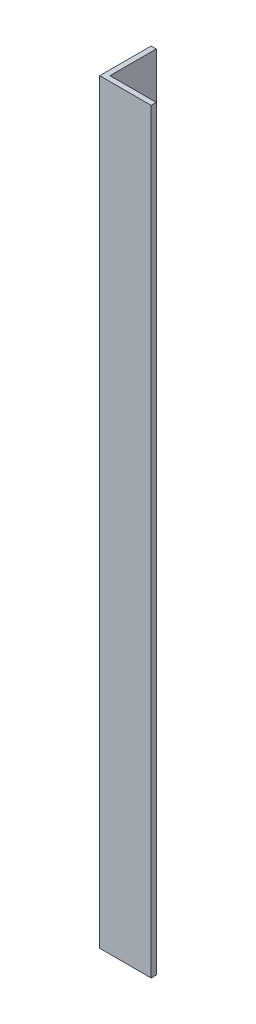
ISO-10303-21;
HEADER;
FILE_DESCRIPTION(('STEP AP214'),'2;1');
FILE_NAME('part.step','',(''),(''),'','','');
FILE_SCHEMA(('AUTOMOTIVE_DESIGN { 1 0 10303 214 1 1 1 1 }'));
ENDSEC;
DATA;
#1=APPLICATION_CONTEXT('core data for automotive mechanical design processes');
#2=APPLICATION_PROTOCOL_DEFINITION('international standard','automotive_design',2000,#1);
#3=PRODUCT_CONTEXT('',#1,'mechanical');
#4=PRODUCT('Part','Part','',(#3));
#5=PRODUCT_RELATED_PRODUCT_CATEGORY('part','',(#4));
#6=PRODUCT_DEFINITION_FORMATION('','',#4);
#7=PRODUCT_DEFINITION_CONTEXT('part definition',#1,'design');
#8=PRODUCT_DEFINITION('design','',#6,#7);
#9=PRODUCT_DEFINITION_SHAPE('','',#8);
#10=(LENGTH_UNIT() NAMED_UNIT(*) SI_UNIT(.MILLI.,.METRE.));
#11=(NAMED_UNIT(*) PLANE_ANGLE_UNIT() SI_UNIT($,.RADIAN.));
#12=(NAMED_UNIT(*) SI_UNIT($,.STERADIAN.) SOLID_ANGLE_UNIT());
#13=UNCERTAINTY_MEASURE_WITH_UNIT(LENGTH_MEASURE(1.E-05),#10,'distance_accuracy_value','');
#14=(GEOMETRIC_REPRESENTATION_CONTEXT(3) GLOBAL_UNCERTAINTY_ASSIGNED_CONTEXT((#13)) GLOBAL_UNIT_ASSIGNED_CONTEXT((#10,
#11,#12)) REPRESENTATION_CONTEXT('',''));
#15=CARTESIAN_POINT('',(0.,0.,0.));
#16=DIRECTION('',(0.,0.,1.));
#17=DIRECTION('',(1.,0.,0.));
#18=AXIS2_PLACEMENT_3D('',#15,#16,#17);
#19=CARTESIAN_POINT('',(0.,294.,0.));
#20=DIRECTION('',(1.,0.,0.));
#21=DIRECTION('',(0.,0.,-1.));
#22=AXIS2_PLACEMENT_3D('',#19,#20,#21);
#23=PLANE('',#22);
#24=DIRECTION('',(0.,0.,1.));
#25=VECTOR('',#24,1.);
#26=CARTESIAN_POINT('',(0.,0.,0.));
#27=LINE('',#26,#25);
#28=CARTESIAN_POINT('',(0.,0.,-20.));
#29=VERTEX_POINT('',#28);
#30=CARTESIAN_POINT('',(0.,0.,0.));
#31=VERTEX_POINT('',#30);
#32=EDGE_CURVE('E128',#29,#31,#27,.T.);
#33=ORIENTED_EDGE('',*,*,#32,.T.);
#34=DIRECTION('',(0.,-1.,0.));
#35=VECTOR('',#34,1.);
#36=CARTESIAN_POINT('',(0.,294.,0.));
#37=LINE('',#36,#35);
#38=CARTESIAN_POINT('',(0.,294.,0.));
#39=VERTEX_POINT('',#38);
#40=EDGE_CURVE('E11',#39,#31,#37,.T.);
#41=ORIENTED_EDGE('',*,*,#40,.F.);
#42=DIRECTION('',(0.,0.,1.));
#43=VECTOR('',#42,1.);
#44=CARTESIAN_POINT('',(0.,294.,0.));
#45=LINE('',#44,#43);
#46=CARTESIAN_POINT('',(0.,294.,-20.));
#47=VERTEX_POINT('',#46);
#48=EDGE_CURVE('E144',#47,#39,#45,.T.);
#49=ORIENTED_EDGE('',*,*,#48,.F.);
#50=DIRECTION('',(0.,-1.,0.));
#51=VECTOR('',#50,1.);
#52=CARTESIAN_POINT('',(0.,294.,-20.));
#53=LINE('',#52,#51);
#54=EDGE_CURVE('E124',#47,#29,#53,.T.);
#55=ORIENTED_EDGE('',*,*,#54,.T.);
#56=EDGE_LOOP('',(#33,#41,#49,#55));
#57=FACE_BOUND('',#56,.T.);
#58=ADVANCED_FACE('F39',(#57),#23,.F.);
#59=CARTESIAN_POINT('',(0.,294.,0.));
#60=DIRECTION('',(0.,0.,-1.));
#61=DIRECTION('',(-1.,0.,0.));
#62=AXIS2_PLACEMENT_3D('',#59,#60,#61);
#63=PLANE('',#62);
#64=DIRECTION('',(1.,0.,0.));
#65=VECTOR('',#64,1.);
#66=CARTESIAN_POINT('',(0.,0.,0.));
#67=LINE('',#66,#65);
#68=CARTESIAN_POINT('',(20.,0.,0.));
#69=VERTEX_POINT('',#68);
#70=EDGE_CURVE('E132',#31,#69,#67,.T.);
#71=ORIENTED_EDGE('',*,*,#70,.T.);
#72=DIRECTION('',(0.,-1.,0.));
#73=VECTOR('',#72,1.);
#74=CARTESIAN_POINT('',(20.,294.,0.));
#75=LINE('',#74,#73);
#76=CARTESIAN_POINT('',(20.,294.,0.));
#77=VERTEX_POINT('',#76);
#78=EDGE_CURVE('E48',#77,#69,#75,.T.);
#79=ORIENTED_EDGE('',*,*,#78,.F.);
#80=DIRECTION('',(1.,0.,0.));
#81=VECTOR('',#80,1.);
#82=CARTESIAN_POINT('',(0.,294.,0.));
#83=LINE('',#82,#81);
#84=EDGE_CURVE('E93',#39,#77,#83,.T.);
#85=ORIENTED_EDGE('',*,*,#84,.F.);
#86=ORIENTED_EDGE('',*,*,#40,.T.);
#87=EDGE_LOOP('',(#71,#79,#85,#86));
#88=FACE_BOUND('',#87,.T.);
#89=ADVANCED_FACE('F172',(#88),#63,.F.);
#90=CARTESIAN_POINT('',(20.,294.,0.));
#91=DIRECTION('',(-1.,0.,0.));
#92=DIRECTION('',(0.,0.,1.));
#93=AXIS2_PLACEMENT_3D('',#90,#91,#92);
#94=PLANE('',#93);
#95=DIRECTION('',(0.,0.,-1.));
#96=VECTOR('',#95,1.);
#97=CARTESIAN_POINT('',(20.,0.,0.));
#98=LINE('',#97,#96);
#99=CARTESIAN_POINT('',(20.,0.,-2.));
#100=VERTEX_POINT('',#99);
#101=EDGE_CURVE('E135',#69,#100,#98,.T.);
#102=ORIENTED_EDGE('',*,*,#101,.T.);
#103=DIRECTION('',(0.,-1.,0.));
#104=VECTOR('',#103,1.);
#105=CARTESIAN_POINT('',(20.,294.,-2.));
#106=LINE('',#105,#104);
#107=CARTESIAN_POINT('',(20.,294.,-2.));
#108=VERTEX_POINT('',#107);
#109=EDGE_CURVE('E117',#108,#100,#106,.T.);
#110=ORIENTED_EDGE('',*,*,#109,.F.);
#111=DIRECTION('',(0.,0.,-1.));
#112=VECTOR('',#111,1.);
#113=CARTESIAN_POINT('',(20.,294.,0.));
#114=LINE('',#113,#112);
#115=EDGE_CURVE('E106',#77,#108,#114,.T.);
#116=ORIENTED_EDGE('',*,*,#115,.F.);
#117=ORIENTED_EDGE('',*,*,#78,.T.);
#118=EDGE_LOOP('',(#102,#110,#116,#117));
#119=FACE_BOUND('',#118,.T.);
#120=ADVANCED_FACE('F154',(#119),#94,.F.);
#121=CARTESIAN_POINT('',(20.,294.,-2.));
#122=DIRECTION('',(0.,0.,1.));
#123=DIRECTION('',(1.,0.,0.));
#124=AXIS2_PLACEMENT_3D('',#121,#122,#123);
#125=PLANE('',#124);
#126=DIRECTION('',(-1.,0.,0.));
#127=VECTOR('',#126,1.);
#128=CARTESIAN_POINT('',(20.,0.,-2.));
#129=LINE('',#128,#127);
#130=CARTESIAN_POINT('',(2.,0.,-2.));
#131=VERTEX_POINT('',#130);
#132=EDGE_CURVE('E115',#100,#131,#129,.T.);
#133=ORIENTED_EDGE('',*,*,#132,.T.);
#134=DIRECTION('',(0.,-1.,0.));
#135=VECTOR('',#134,1.);
#136=CARTESIAN_POINT('',(2.,294.,-2.));
#137=LINE('',#136,#135);
#138=CARTESIAN_POINT('',(2.,294.,-2.));
#139=VERTEX_POINT('',#138);
#140=EDGE_CURVE('E112',#139,#131,#137,.T.);
#141=ORIENTED_EDGE('',*,*,#140,.F.);
#142=DIRECTION('',(-1.,0.,0.));
#143=VECTOR('',#142,1.);
#144=CARTESIAN_POINT('',(20.,294.,-2.));
#145=LINE('',#144,#143);
#146=EDGE_CURVE('E100',#108,#139,#145,.T.);
#147=ORIENTED_EDGE('',*,*,#146,.F.);
#148=ORIENTED_EDGE('',*,*,#109,.T.);
#149=EDGE_LOOP('',(#133,#141,#147,#148));
#150=FACE_BOUND('',#149,.T.);
#151=ADVANCED_FACE('F113',(#150),#125,.F.);
#152=CARTESIAN_POINT('',(2.,294.,-20.));
#153=DIRECTION('',(-1.,0.,0.));
#154=DIRECTION('',(0.,0.,1.));
#155=AXIS2_PLACEMENT_3D('',#152,#153,#154);
#156=PLANE('',#155);
#157=DIRECTION('',(0.,0.,-1.));
#158=VECTOR('',#157,1.);
#159=CARTESIAN_POINT('',(2.,0.,-20.));
#160=LINE('',#159,#158);
#161=CARTESIAN_POINT('',(2.,0.,-20.));
#162=VERTEX_POINT('',#161);
#163=EDGE_CURVE('E79',#131,#162,#160,.T.);
#164=ORIENTED_EDGE('',*,*,#163,.T.);
#165=DIRECTION('',(0.,-1.,0.));
#166=VECTOR('',#165,1.);
#167=CARTESIAN_POINT('',(2.,294.,-20.));
#168=LINE('',#167,#166);
#169=CARTESIAN_POINT('',(2.,294.,-20.));
#170=VERTEX_POINT('',#169);
#171=EDGE_CURVE('E118',#170,#162,#168,.T.);
#172=ORIENTED_EDGE('',*,*,#171,.F.);
#173=DIRECTION('',(0.,0.,-1.));
#174=VECTOR('',#173,1.);
#175=CARTESIAN_POINT('',(2.,294.,-20.));
#176=LINE('',#175,#174);
#177=EDGE_CURVE('E104',#139,#170,#176,.T.);
#178=ORIENTED_EDGE('',*,*,#177,.F.);
#179=ORIENTED_EDGE('',*,*,#140,.T.);
#180=EDGE_LOOP('',(#164,#172,#178,#179));
#181=FACE_BOUND('',#180,.T.);
#182=ADVANCED_FACE('F120',(#181),#156,.F.);
#183=CARTESIAN_POINT('',(0.,294.,-20.));
#184=DIRECTION('',(0.,0.,1.));
#185=DIRECTION('',(1.,0.,0.));
#186=AXIS2_PLACEMENT_3D('',#183,#184,#185);
#187=PLANE('',#186);
#188=DIRECTION('',(-1.,0.,0.));
#189=VECTOR('',#188,1.);
#190=CARTESIAN_POINT('',(0.,0.,-20.));
#191=LINE('',#190,#189);
#192=EDGE_CURVE('E85',#162,#29,#191,.T.);
#193=ORIENTED_EDGE('',*,*,#192,.T.);
#194=ORIENTED_EDGE('',*,*,#54,.F.);
#195=DIRECTION('',(-1.,0.,0.));
#196=VECTOR('',#195,1.);
#197=CARTESIAN_POINT('',(0.,294.,-20.));
#198=LINE('',#197,#196);
#199=EDGE_CURVE('E56',#170,#47,#198,.T.);
#200=ORIENTED_EDGE('',*,*,#199,.F.);
#201=ORIENTED_EDGE('',*,*,#171,.T.);
#202=EDGE_LOOP('',(#193,#194,#200,#201));
#203=FACE_BOUND('',#202,.T.);
#204=ADVANCED_FACE('F161',(#203),#187,.F.);
#205=CARTESIAN_POINT('',(0.,294.,0.));
#206=DIRECTION('',(0.,-1.,0.));
#207=DIRECTION('',(0.,0.,-1.));
#208=AXIS2_PLACEMENT_3D('',#205,#206,#207);
#209=PLANE('',#208);
#210=ORIENTED_EDGE('',*,*,#48,.T.);
#211=ORIENTED_EDGE('',*,*,#84,.T.);
#212=ORIENTED_EDGE('',*,*,#115,.T.);
#213=ORIENTED_EDGE('',*,*,#146,.T.);
#214=ORIENTED_EDGE('',*,*,#177,.T.);
#215=ORIENTED_EDGE('',*,*,#199,.T.);
#216=EDGE_LOOP('',(#210,#211,#212,#213,#214,#215));
#217=FACE_BOUND('',#216,.T.);
#218=ADVANCED_FACE('F102',(#217),#209,.F.);
#219=CARTESIAN_POINT('',(0.,0.,0.));
#220=DIRECTION('',(0.,-1.,0.));
#221=DIRECTION('',(0.,0.,-1.));
#222=AXIS2_PLACEMENT_3D('',#219,#220,#221);
#223=PLANE('',#222);
#224=ORIENTED_EDGE('',*,*,#32,.F.);
#225=ORIENTED_EDGE('',*,*,#192,.F.);
#226=ORIENTED_EDGE('',*,*,#163,.F.);
#227=ORIENTED_EDGE('',*,*,#132,.F.);
#228=ORIENTED_EDGE('',*,*,#101,.F.);
#229=ORIENTED_EDGE('',*,*,#70,.F.);
#230=EDGE_LOOP('',(#224,#225,#226,#227,#228,#229));
#231=FACE_BOUND('',#230,.T.);
#232=ADVANCED_FACE('F157',(#231),#223,.T.);
#233=CLOSED_SHELL('',(#58,#89,#120,#151,#182,#204,#218,#232));
#234=MANIFOLD_SOLID_BREP('B2',#233);
#235=ADVANCED_BREP_SHAPE_REPRESENTATION('',(#18,#234),#14);
#236=SHAPE_DEFINITION_REPRESENTATION(#9,#235);
ENDSEC;
END-ISO-10303-21;
